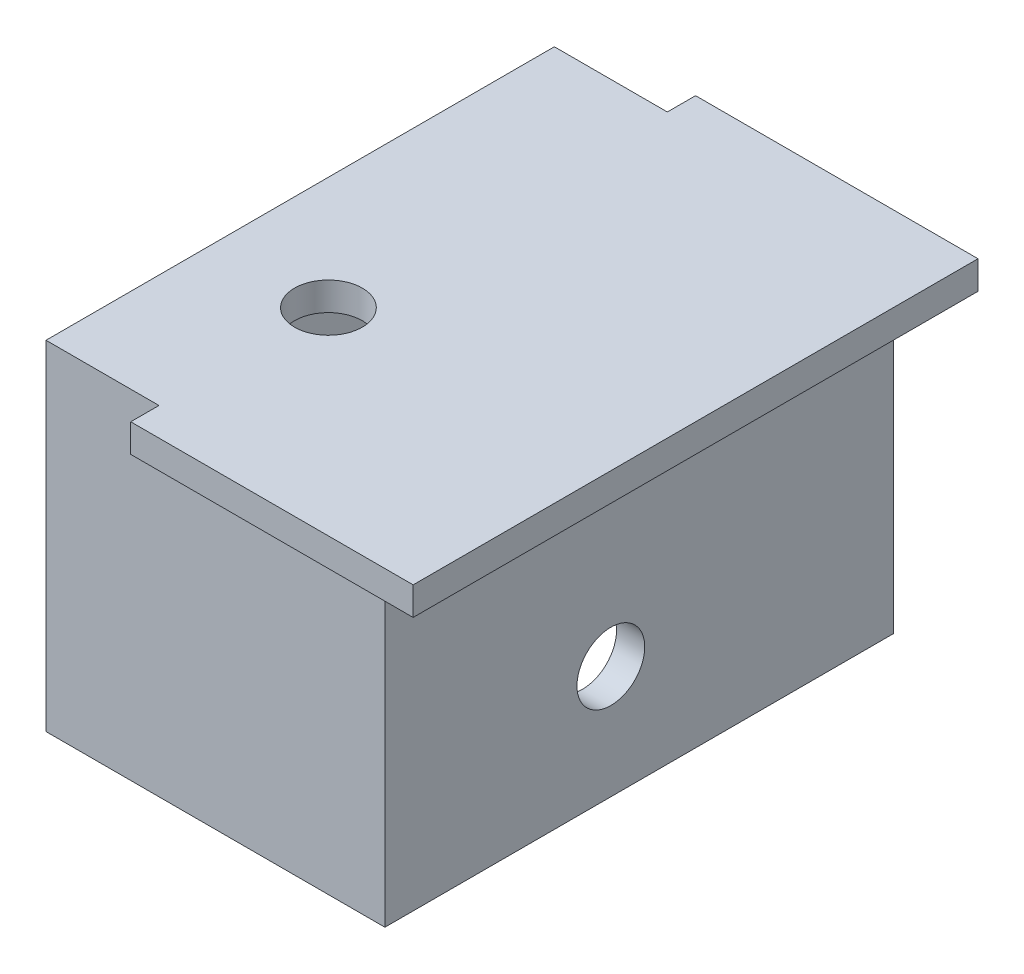
ISO-10303-21;
HEADER;
FILE_DESCRIPTION(('STEP AP214'),'2;1');
FILE_NAME('part.step','',(''),(''),'','','');
FILE_SCHEMA(('AUTOMOTIVE_DESIGN { 1 0 10303 214 1 1 1 1 }'));
ENDSEC;
DATA;
#1=APPLICATION_CONTEXT('core data for automotive mechanical design processes');
#2=APPLICATION_PROTOCOL_DEFINITION('international standard','automotive_design',2000,#1);
#3=PRODUCT_CONTEXT('',#1,'mechanical');
#4=PRODUCT('Part','Part','',(#3));
#5=PRODUCT_RELATED_PRODUCT_CATEGORY('part','',(#4));
#6=PRODUCT_DEFINITION_FORMATION('','',#4);
#7=PRODUCT_DEFINITION_CONTEXT('part definition',#1,'design');
#8=PRODUCT_DEFINITION('design','',#6,#7);
#9=PRODUCT_DEFINITION_SHAPE('','',#8);
#10=(LENGTH_UNIT() NAMED_UNIT(*) SI_UNIT(.MILLI.,.METRE.));
#11=(NAMED_UNIT(*) PLANE_ANGLE_UNIT() SI_UNIT($,.RADIAN.));
#12=(NAMED_UNIT(*) SI_UNIT($,.STERADIAN.) SOLID_ANGLE_UNIT());
#13=UNCERTAINTY_MEASURE_WITH_UNIT(LENGTH_MEASURE(1.E-05),#10,'distance_accuracy_value','');
#14=(GEOMETRIC_REPRESENTATION_CONTEXT(3) GLOBAL_UNCERTAINTY_ASSIGNED_CONTEXT((#13)) GLOBAL_UNIT_ASSIGNED_CONTEXT((#10,
#11,#12)) REPRESENTATION_CONTEXT('',''));
#15=CARTESIAN_POINT('',(0.,0.,0.));
#16=DIRECTION('',(0.,0.,1.));
#17=DIRECTION('',(1.,0.,0.));
#18=AXIS2_PLACEMENT_3D('',#15,#16,#17);
#19=CARTESIAN_POINT('',(0.,0.,100.));
#20=DIRECTION('',(0.,1.,0.));
#21=DIRECTION('',(-1.,0.,0.));
#22=AXIS2_PLACEMENT_3D('',#19,#20,#21);
#23=PLANE('',#22);
#24=CARTESIAN_POINT('',(-50.,0.,65.));
#25=DIRECTION('',(0.,1.,0.));
#26=DIRECTION('',(-1.,0.,0.));
#27=AXIS2_PLACEMENT_3D('',#24,#25,#26);
#28=CIRCLE('',#27,6.);
#29=CARTESIAN_POINT('',(-56.,0.,65.));
#30=VERTEX_POINT('',#29);
#31=EDGE_CURVE('E195',#30,#30,#28,.T.);
#32=ORIENTED_EDGE('',*,*,#31,.T.);
#33=EDGE_LOOP('',(#32));
#34=FACE_BOUND('',#33,.T.);
#35=DIRECTION('',(1.,0.,0.));
#36=VECTOR('',#35,1.);
#37=CARTESIAN_POINT('',(-65.,0.,90.));
#38=LINE('',#37,#36);
#39=CARTESIAN_POINT('',(-65.,0.,90.));
#40=VERTEX_POINT('',#39);
#41=CARTESIAN_POINT('',(-15.,0.,90.));
#42=VERTEX_POINT('',#41);
#43=EDGE_CURVE('E50',#40,#42,#38,.T.);
#44=ORIENTED_EDGE('',*,*,#43,.F.);
#45=DIRECTION('',(0.,0.,-1.));
#46=VECTOR('',#45,1.);
#47=CARTESIAN_POINT('',(-65.,0.,100.));
#48=LINE('',#47,#46);
#49=CARTESIAN_POINT('',(-65.,0.,10.));
#50=VERTEX_POINT('',#49);
#51=EDGE_CURVE('E249',#40,#50,#48,.T.);
#52=ORIENTED_EDGE('',*,*,#51,.T.);
#53=DIRECTION('',(-1.,0.,0.));
#54=VECTOR('',#53,1.);
#55=CARTESIAN_POINT('',(-15.,0.,10.));
#56=LINE('',#55,#54);
#57=CARTESIAN_POINT('',(-15.,0.,10.));
#58=VERTEX_POINT('',#57);
#59=EDGE_CURVE('E157',#58,#50,#56,.T.);
#60=ORIENTED_EDGE('',*,*,#59,.F.);
#61=DIRECTION('',(0.,0.,-1.));
#62=VECTOR('',#61,1.);
#63=CARTESIAN_POINT('',(-15.,0.,5.));
#64=LINE('',#63,#62);
#65=EDGE_CURVE('E160',#42,#58,#64,.T.);
#66=ORIENTED_EDGE('',*,*,#65,.F.);
#67=EDGE_LOOP('',(#44,#52,#60,#66));
#68=FACE_BOUND('',#67,.T.);
#69=ADVANCED_FACE('F33',(#34,#68),#23,.F.);
#70=DIRECTION('',(0.,0.,1.));
#71=VECTOR('',#70,1.);
#72=CARTESIAN_POINT('',(-50.,0.,95.));
#73=LINE('',#72,#71);
#74=CARTESIAN_POINT('',(-50.,0.,95.));
#75=VERTEX_POINT('',#74);
#76=CARTESIAN_POINT('',(-50.,0.,100.));
#77=VERTEX_POINT('',#76);
#78=EDGE_CURVE('E216',#75,#77,#73,.T.);
#79=ORIENTED_EDGE('',*,*,#78,.F.);
#80=DIRECTION('',(-1.,0.,0.));
#81=VECTOR('',#80,1.);
#82=CARTESIAN_POINT('',(-10.,0.,95.));
#83=LINE('',#82,#81);
#84=CARTESIAN_POINT('',(-10.,0.,95.));
#85=VERTEX_POINT('',#84);
#86=EDGE_CURVE('E182',#85,#75,#83,.T.);
#87=ORIENTED_EDGE('',*,*,#86,.F.);
#88=DIRECTION('',(0.,0.,1.));
#89=VECTOR('',#88,1.);
#90=CARTESIAN_POINT('',(-10.,0.,5.));
#91=LINE('',#90,#89);
#92=CARTESIAN_POINT('',(-10.,0.,5.));
#93=VERTEX_POINT('',#92);
#94=EDGE_CURVE('E176',#93,#85,#91,.T.);
#95=ORIENTED_EDGE('',*,*,#94,.F.);
#96=DIRECTION('',(1.,0.,0.));
#97=VECTOR('',#96,1.);
#98=CARTESIAN_POINT('',(-10.,0.,5.));
#99=LINE('',#98,#97);
#100=CARTESIAN_POINT('',(-50.,0.,5.));
#101=VERTEX_POINT('',#100);
#102=EDGE_CURVE('E178',#101,#93,#99,.T.);
#103=ORIENTED_EDGE('',*,*,#102,.F.);
#104=DIRECTION('',(0.,0.,-1.));
#105=VECTOR('',#104,1.);
#106=CARTESIAN_POINT('',(-50.,0.,5.));
#107=LINE('',#106,#105);
#108=CARTESIAN_POINT('',(-50.,0.,0.));
#109=VERTEX_POINT('',#108);
#110=EDGE_CURVE('E205',#101,#109,#107,.T.);
#111=ORIENTED_EDGE('',*,*,#110,.T.);
#112=DIRECTION('',(1.,0.,0.));
#113=VECTOR('',#112,1.);
#114=CARTESIAN_POINT('',(0.,0.,0.));
#115=LINE('',#114,#113);
#116=CARTESIAN_POINT('',(0.,0.,0.));
#117=VERTEX_POINT('',#116);
#118=EDGE_CURVE('E235',#109,#117,#115,.T.);
#119=ORIENTED_EDGE('',*,*,#118,.T.);
#120=DIRECTION('',(0.,0.,-1.));
#121=VECTOR('',#120,1.);
#122=CARTESIAN_POINT('',(0.,0.,100.));
#123=LINE('',#122,#121);
#124=CARTESIAN_POINT('',(0.,0.,100.));
#125=VERTEX_POINT('',#124);
#126=EDGE_CURVE('E240',#125,#117,#123,.T.);
#127=ORIENTED_EDGE('',*,*,#126,.F.);
#128=DIRECTION('',(1.,0.,0.));
#129=VECTOR('',#128,1.);
#130=CARTESIAN_POINT('',(0.,0.,100.));
#131=LINE('',#130,#129);
#132=EDGE_CURVE('E238',#77,#125,#131,.T.);
#133=ORIENTED_EDGE('',*,*,#132,.F.);
#134=EDGE_LOOP('',(#79,#87,#95,#103,#111,#119,#127,#133));
#135=FACE_BOUND('',#134,.T.);
#136=ADVANCED_FACE('F275',(#135),#23,.F.);
#137=CARTESIAN_POINT('',(-65.,0.,100.));
#138=DIRECTION('',(-1.,0.,0.));
#139=DIRECTION('',(0.,0.,1.));
#140=AXIS2_PLACEMENT_3D('',#137,#138,#139);
#141=PLANE('',#140);
#142=CARTESIAN_POINT('',(-65.,-35.,55.));
#143=DIRECTION('',(-1.,0.,0.));
#144=DIRECTION('',(0.,0.,1.));
#145=AXIS2_PLACEMENT_3D('',#142,#143,#144);
#146=CIRCLE('',#145,5.99999999999999);
#147=CARTESIAN_POINT('',(-65.,-35.,61.));
#148=VERTEX_POINT('',#147);
#149=EDGE_CURVE('E173',#148,#148,#146,.T.);
#150=ORIENTED_EDGE('',*,*,#149,.T.);
#151=EDGE_LOOP('',(#150));
#152=FACE_BOUND('',#151,.T.);
#153=DIRECTION('',(0.,1.,0.));
#154=VECTOR('',#153,1.);
#155=CARTESIAN_POINT('',(-65.,-55.,90.));
#156=LINE('',#155,#154);
#157=CARTESIAN_POINT('',(-65.,-55.,90.));
#158=VERTEX_POINT('',#157);
#159=EDGE_CURVE('E522',#158,#40,#156,.T.);
#160=ORIENTED_EDGE('',*,*,#159,.F.);
#161=DIRECTION('',(0.,0.,-1.));
#162=VECTOR('',#161,1.);
#163=CARTESIAN_POINT('',(-65.,-55.,100.));
#164=LINE('',#163,#162);
#165=CARTESIAN_POINT('',(-65.,-55.,10.));
#166=VERTEX_POINT('',#165);
#167=EDGE_CURVE('E251',#158,#166,#164,.T.);
#168=ORIENTED_EDGE('',*,*,#167,.T.);
#169=DIRECTION('',(0.,1.,0.));
#170=VECTOR('',#169,1.);
#171=CARTESIAN_POINT('',(-65.,-55.,10.));
#172=LINE('',#171,#170);
#173=EDGE_CURVE('E156',#166,#50,#172,.T.);
#174=ORIENTED_EDGE('',*,*,#173,.T.);
#175=ORIENTED_EDGE('',*,*,#51,.F.);
#176=EDGE_LOOP('',(#160,#168,#174,#175));
#177=FACE_BOUND('',#176,.T.);
#178=ADVANCED_FACE('F280',(#152,#177),#141,.F.);
#179=CARTESIAN_POINT('',(-15.,-55.,5.));
#180=DIRECTION('',(1.,0.,0.));
#181=DIRECTION('',(0.,1.,0.));
#182=AXIS2_PLACEMENT_3D('',#179,#180,#181);
#183=PLANE('',#182);
#184=CARTESIAN_POINT('',(-15.,-35.,55.));
#185=DIRECTION('',(1.,0.,0.));
#186=DIRECTION('',(0.,1.,0.));
#187=AXIS2_PLACEMENT_3D('',#184,#185,#186);
#188=CIRCLE('',#187,5.99999999999999);
#189=CARTESIAN_POINT('',(-15.,-29.,55.));
#190=VERTEX_POINT('',#189);
#191=EDGE_CURVE('E37',#190,#190,#188,.T.);
#192=ORIENTED_EDGE('',*,*,#191,.T.);
#193=EDGE_LOOP('',(#192));
#194=FACE_BOUND('',#193,.T.);
#195=DIRECTION('',(0.,1.,0.));
#196=VECTOR('',#195,1.);
#197=CARTESIAN_POINT('',(-15.,-55.,90.));
#198=LINE('',#197,#196);
#199=CARTESIAN_POINT('',(-15.,-55.,90.));
#200=VERTEX_POINT('',#199);
#201=EDGE_CURVE('E58',#200,#42,#198,.T.);
#202=ORIENTED_EDGE('',*,*,#201,.T.);
#203=ORIENTED_EDGE('',*,*,#65,.T.);
#204=DIRECTION('',(0.,1.,0.));
#205=VECTOR('',#204,1.);
#206=CARTESIAN_POINT('',(-15.,-55.,10.));
#207=LINE('',#206,#205);
#208=CARTESIAN_POINT('',(-15.,-55.,10.));
#209=VERTEX_POINT('',#208);
#210=EDGE_CURVE('E153',#209,#58,#207,.T.);
#211=ORIENTED_EDGE('',*,*,#210,.F.);
#212=DIRECTION('',(0.,0.,-1.));
#213=VECTOR('',#212,1.);
#214=CARTESIAN_POINT('',(-15.,-55.,5.));
#215=LINE('',#214,#213);
#216=EDGE_CURVE('E136',#200,#209,#215,.T.);
#217=ORIENTED_EDGE('',*,*,#216,.F.);
#218=EDGE_LOOP('',(#202,#203,#211,#217));
#219=FACE_BOUND('',#218,.T.);
#220=ADVANCED_FACE('F159',(#194,#219),#183,.F.);
#221=CARTESIAN_POINT('',(0.,5.,100.));
#222=DIRECTION('',(0.,-1.,0.));
#223=DIRECTION('',(1.,0.,0.));
#224=AXIS2_PLACEMENT_3D('',#221,#222,#223);
#225=PLANE('',#224);
#226=CARTESIAN_POINT('',(-50.,5.,65.));
#227=DIRECTION('',(0.,1.,0.));
#228=DIRECTION('',(-1.,0.,0.));
#229=AXIS2_PLACEMENT_3D('',#226,#227,#228);
#230=CIRCLE('',#229,6.);
#231=CARTESIAN_POINT('',(-56.,5.,65.));
#232=VERTEX_POINT('',#231);
#233=EDGE_CURVE('E192',#232,#232,#230,.T.);
#234=ORIENTED_EDGE('',*,*,#233,.F.);
#235=EDGE_LOOP('',(#234));
#236=FACE_BOUND('',#235,.T.);
#237=DIRECTION('',(1.,0.,0.));
#238=VECTOR('',#237,1.);
#239=CARTESIAN_POINT('',(-65.,5.,5.));
#240=LINE('',#239,#238);
#241=CARTESIAN_POINT('',(-70.,4.99999999999999,5.));
#242=VERTEX_POINT('',#241);
#243=CARTESIAN_POINT('',(-50.,5.,5.));
#244=VERTEX_POINT('',#243);
#245=EDGE_CURVE('E196',#242,#244,#240,.T.);
#246=ORIENTED_EDGE('',*,*,#245,.F.);
#247=DIRECTION('',(0.,0.,1.));
#248=VECTOR('',#247,1.);
#249=CARTESIAN_POINT('',(-70.,4.99999999999999,0.));
#250=LINE('',#249,#248);
#251=CARTESIAN_POINT('',(-70.,4.99999999999999,95.));
#252=VERTEX_POINT('',#251);
#253=EDGE_CURVE('E161',#242,#252,#250,.T.);
#254=ORIENTED_EDGE('',*,*,#253,.T.);
#255=DIRECTION('',(-1.,0.,0.));
#256=VECTOR('',#255,1.);
#257=CARTESIAN_POINT('',(-65.,5.,95.));
#258=LINE('',#257,#256);
#259=CARTESIAN_POINT('',(-50.,5.,95.));
#260=VERTEX_POINT('',#259);
#261=EDGE_CURVE('E213',#260,#252,#258,.T.);
#262=ORIENTED_EDGE('',*,*,#261,.F.);
#263=DIRECTION('',(0.,0.,1.));
#264=VECTOR('',#263,1.);
#265=CARTESIAN_POINT('',(-50.,5.,95.));
#266=LINE('',#265,#264);
#267=CARTESIAN_POINT('',(-50.,5.,100.));
#268=VERTEX_POINT('',#267);
#269=EDGE_CURVE('E218',#260,#268,#266,.T.);
#270=ORIENTED_EDGE('',*,*,#269,.T.);
#271=DIRECTION('',(-1.,0.,0.));
#272=VECTOR('',#271,1.);
#273=CARTESIAN_POINT('',(0.,5.,100.));
#274=LINE('',#273,#272);
#275=CARTESIAN_POINT('',(0.,5.,100.));
#276=VERTEX_POINT('',#275);
#277=EDGE_CURVE('E234',#276,#268,#274,.T.);
#278=ORIENTED_EDGE('',*,*,#277,.F.);
#279=DIRECTION('',(0.,0.,-1.));
#280=VECTOR('',#279,1.);
#281=CARTESIAN_POINT('',(0.,5.,100.));
#282=LINE('',#281,#280);
#283=CARTESIAN_POINT('',(0.,5.,0.));
#284=VERTEX_POINT('',#283);
#285=EDGE_CURVE('E11',#276,#284,#282,.T.);
#286=ORIENTED_EDGE('',*,*,#285,.T.);
#287=DIRECTION('',(-1.,0.,0.));
#288=VECTOR('',#287,1.);
#289=CARTESIAN_POINT('',(0.,5.,0.));
#290=LINE('',#289,#288);
#291=CARTESIAN_POINT('',(-50.,5.,0.));
#292=VERTEX_POINT('',#291);
#293=EDGE_CURVE('E243',#284,#292,#290,.T.);
#294=ORIENTED_EDGE('',*,*,#293,.T.);
#295=DIRECTION('',(0.,0.,-1.));
#296=VECTOR('',#295,1.);
#297=CARTESIAN_POINT('',(-50.,5.,5.));
#298=LINE('',#297,#296);
#299=EDGE_CURVE('E203',#244,#292,#298,.T.);
#300=ORIENTED_EDGE('',*,*,#299,.F.);
#301=EDGE_LOOP('',(#246,#254,#262,#270,#278,#286,#294,#300));
#302=FACE_BOUND('',#301,.T.);
#303=ADVANCED_FACE('F293',(#236,#302),#225,.F.);
#304=CARTESIAN_POINT('',(-70.,0.,100.));
#305=DIRECTION('',(1.,0.,0.));
#306=DIRECTION('',(0.,1.,0.));
#307=AXIS2_PLACEMENT_3D('',#304,#305,#306);
#308=PLANE('',#307);
#309=CARTESIAN_POINT('',(-70.,-35.,55.));
#310=DIRECTION('',(-1.,0.,0.));
#311=DIRECTION('',(0.,-1.,0.));
#312=AXIS2_PLACEMENT_3D('',#309,#310,#311);
#313=CIRCLE('',#312,5.99999999999999);
#314=CARTESIAN_POINT('',(-70.,-41.,55.));
#315=VERTEX_POINT('',#314);
#316=EDGE_CURVE('E163',#315,#315,#313,.T.);
#317=ORIENTED_EDGE('',*,*,#316,.F.);
#318=EDGE_LOOP('',(#317));
#319=FACE_BOUND('',#318,.T.);
#320=ORIENTED_EDGE('',*,*,#253,.F.);
#321=DIRECTION('',(0.,1.,0.));
#322=VECTOR('',#321,1.);
#323=CARTESIAN_POINT('',(-70.,0.,5.));
#324=LINE('',#323,#322);
#325=CARTESIAN_POINT('',(-70.,-55.,5.));
#326=VERTEX_POINT('',#325);
#327=EDGE_CURVE('E224',#326,#242,#324,.T.);
#328=ORIENTED_EDGE('',*,*,#327,.F.);
#329=DIRECTION('',(0.,0.,-1.));
#330=VECTOR('',#329,1.);
#331=CARTESIAN_POINT('',(-70.,-55.,100.));
#332=LINE('',#331,#330);
#333=CARTESIAN_POINT('',(-70.,-55.,95.));
#334=VERTEX_POINT('',#333);
#335=EDGE_CURVE('E42',#334,#326,#332,.T.);
#336=ORIENTED_EDGE('',*,*,#335,.F.);
#337=DIRECTION('',(0.,-1.,0.));
#338=VECTOR('',#337,1.);
#339=CARTESIAN_POINT('',(-70.,0.,95.));
#340=LINE('',#339,#338);
#341=EDGE_CURVE('E226',#252,#334,#340,.T.);
#342=ORIENTED_EDGE('',*,*,#341,.F.);
#343=EDGE_LOOP('',(#320,#328,#336,#342));
#344=FACE_BOUND('',#343,.T.);
#345=ADVANCED_FACE('F291',(#319,#344),#308,.F.);
#346=CARTESIAN_POINT('',(-65.,-55.,100.));
#347=DIRECTION('',(0.,1.,0.));
#348=DIRECTION('',(0.,0.,1.));
#349=AXIS2_PLACEMENT_3D('',#346,#347,#348);
#350=PLANE('',#349);
#351=ORIENTED_EDGE('',*,*,#167,.F.);
#352=DIRECTION('',(1.,0.,0.));
#353=VECTOR('',#352,1.);
#354=CARTESIAN_POINT('',(-65.,-55.,90.));
#355=LINE('',#354,#353);
#356=EDGE_CURVE('E144',#158,#200,#355,.T.);
#357=ORIENTED_EDGE('',*,*,#356,.T.);
#358=ORIENTED_EDGE('',*,*,#216,.T.);
#359=DIRECTION('',(-1.,0.,0.));
#360=VECTOR('',#359,1.);
#361=CARTESIAN_POINT('',(-15.,-55.,10.));
#362=LINE('',#361,#360);
#363=EDGE_CURVE('E141',#209,#166,#362,.T.);
#364=ORIENTED_EDGE('',*,*,#363,.T.);
#365=EDGE_LOOP('',(#351,#357,#358,#364));
#366=FACE_BOUND('',#365,.T.);
#367=DIRECTION('',(-1.,0.,0.));
#368=VECTOR('',#367,1.);
#369=CARTESIAN_POINT('',(-65.,-55.,5.));
#370=LINE('',#369,#368);
#371=CARTESIAN_POINT('',(-10.,-55.,5.));
#372=VERTEX_POINT('',#371);
#373=EDGE_CURVE('E221',#372,#326,#370,.T.);
#374=ORIENTED_EDGE('',*,*,#373,.F.);
#375=DIRECTION('',(0.,0.,1.));
#376=VECTOR('',#375,1.);
#377=CARTESIAN_POINT('',(-10.,-55.,5.));
#378=LINE('',#377,#376);
#379=CARTESIAN_POINT('',(-10.,-55.,95.));
#380=VERTEX_POINT('',#379);
#381=EDGE_CURVE('E147',#372,#380,#378,.T.);
#382=ORIENTED_EDGE('',*,*,#381,.T.);
#383=DIRECTION('',(1.,0.,0.));
#384=VECTOR('',#383,1.);
#385=CARTESIAN_POINT('',(-65.,-55.,95.));
#386=LINE('',#385,#384);
#387=EDGE_CURVE('E228',#334,#380,#386,.T.);
#388=ORIENTED_EDGE('',*,*,#387,.F.);
#389=ORIENTED_EDGE('',*,*,#335,.T.);
#390=EDGE_LOOP('',(#374,#382,#388,#389));
#391=FACE_BOUND('',#390,.T.);
#392=ADVANCED_FACE('F139',(#366,#391),#350,.F.);
#393=CARTESIAN_POINT('',(0.,0.,100.));
#394=DIRECTION('',(-1.,0.,0.));
#395=DIRECTION('',(0.,0.,1.));
#396=AXIS2_PLACEMENT_3D('',#393,#394,#395);
#397=PLANE('',#396);
#398=DIRECTION('',(0.,1.,0.));
#399=VECTOR('',#398,1.);
#400=CARTESIAN_POINT('',(0.,0.,0.));
#401=LINE('',#400,#399);
#402=EDGE_CURVE('E230',#117,#284,#401,.T.);
#403=ORIENTED_EDGE('',*,*,#402,.T.);
#404=ORIENTED_EDGE('',*,*,#285,.F.);
#405=DIRECTION('',(0.,1.,0.));
#406=VECTOR('',#405,1.);
#407=CARTESIAN_POINT('',(0.,0.,100.));
#408=LINE('',#407,#406);
#409=EDGE_CURVE('E231',#125,#276,#408,.T.);
#410=ORIENTED_EDGE('',*,*,#409,.F.);
#411=ORIENTED_EDGE('',*,*,#126,.T.);
#412=EDGE_LOOP('',(#403,#404,#410,#411));
#413=FACE_BOUND('',#412,.T.);
#414=ADVANCED_FACE('F35',(#413),#397,.F.);
#415=CARTESIAN_POINT('',(0.,0.,100.));
#416=DIRECTION('',(0.,0.,1.));
#417=DIRECTION('',(1.,0.,0.));
#418=AXIS2_PLACEMENT_3D('',#415,#416,#417);
#419=PLANE('',#418);
#420=DIRECTION('',(0.,1.,0.));
#421=VECTOR('',#420,1.);
#422=CARTESIAN_POINT('',(-50.,5.,100.));
#423=LINE('',#422,#421);
#424=EDGE_CURVE('E208',#77,#268,#423,.T.);
#425=ORIENTED_EDGE('',*,*,#424,.F.);
#426=ORIENTED_EDGE('',*,*,#132,.T.);
#427=ORIENTED_EDGE('',*,*,#409,.T.);
#428=ORIENTED_EDGE('',*,*,#277,.T.);
#429=EDGE_LOOP('',(#425,#426,#427,#428));
#430=FACE_BOUND('',#429,.T.);
#431=ADVANCED_FACE('F320',(#430),#419,.T.);
#432=CARTESIAN_POINT('',(0.,0.,0.));
#433=DIRECTION('',(0.,0.,1.));
#434=DIRECTION('',(1.,0.,0.));
#435=AXIS2_PLACEMENT_3D('',#432,#433,#434);
#436=PLANE('',#435);
#437=ORIENTED_EDGE('',*,*,#118,.F.);
#438=DIRECTION('',(0.,-1.,0.));
#439=VECTOR('',#438,1.);
#440=CARTESIAN_POINT('',(-50.,5.,0.));
#441=LINE('',#440,#439);
#442=EDGE_CURVE('E200',#292,#109,#441,.T.);
#443=ORIENTED_EDGE('',*,*,#442,.F.);
#444=ORIENTED_EDGE('',*,*,#293,.F.);
#445=ORIENTED_EDGE('',*,*,#402,.F.);
#446=EDGE_LOOP('',(#437,#443,#444,#445));
#447=FACE_BOUND('',#446,.T.);
#448=ADVANCED_FACE('F284',(#447),#436,.F.);
#449=CARTESIAN_POINT('',(0.,0.,95.));
#450=DIRECTION('',(0.,0.,-1.));
#451=DIRECTION('',(-1.,0.,0.));
#452=AXIS2_PLACEMENT_3D('',#449,#450,#451);
#453=PLANE('',#452);
#454=ORIENTED_EDGE('',*,*,#387,.T.);
#455=DIRECTION('',(0.,1.,0.));
#456=VECTOR('',#455,1.);
#457=CARTESIAN_POINT('',(-10.,-55.,95.));
#458=LINE('',#457,#456);
#459=EDGE_CURVE('E189',#380,#85,#458,.T.);
#460=ORIENTED_EDGE('',*,*,#459,.T.);
#461=ORIENTED_EDGE('',*,*,#86,.T.);
#462=DIRECTION('',(0.,1.,0.));
#463=VECTOR('',#462,1.);
#464=CARTESIAN_POINT('',(-50.,5.,95.));
#465=LINE('',#464,#463);
#466=EDGE_CURVE('E210',#75,#260,#465,.T.);
#467=ORIENTED_EDGE('',*,*,#466,.T.);
#468=ORIENTED_EDGE('',*,*,#261,.T.);
#469=ORIENTED_EDGE('',*,*,#341,.T.);
#470=EDGE_LOOP('',(#454,#460,#461,#467,#468,#469));
#471=FACE_BOUND('',#470,.T.);
#472=ADVANCED_FACE('F315',(#471),#453,.F.);
#473=CARTESIAN_POINT('',(0.,0.,5.));
#474=DIRECTION('',(0.,0.,-1.));
#475=DIRECTION('',(-1.,0.,0.));
#476=AXIS2_PLACEMENT_3D('',#473,#474,#475);
#477=PLANE('',#476);
#478=DIRECTION('',(0.,1.,0.));
#479=VECTOR('',#478,1.);
#480=CARTESIAN_POINT('',(-10.,-55.,5.));
#481=LINE('',#480,#479);
#482=EDGE_CURVE('E146',#372,#93,#481,.T.);
#483=ORIENTED_EDGE('',*,*,#482,.F.);
#484=ORIENTED_EDGE('',*,*,#373,.T.);
#485=ORIENTED_EDGE('',*,*,#327,.T.);
#486=ORIENTED_EDGE('',*,*,#245,.T.);
#487=DIRECTION('',(0.,-1.,0.));
#488=VECTOR('',#487,1.);
#489=CARTESIAN_POINT('',(-50.,5.,5.));
#490=LINE('',#489,#488);
#491=EDGE_CURVE('E199',#244,#101,#490,.T.);
#492=ORIENTED_EDGE('',*,*,#491,.T.);
#493=ORIENTED_EDGE('',*,*,#102,.T.);
#494=EDGE_LOOP('',(#483,#484,#485,#486,#492,#493));
#495=FACE_BOUND('',#494,.T.);
#496=ADVANCED_FACE('F333',(#495),#477,.T.);
#497=CARTESIAN_POINT('',(-50.,5.,95.));
#498=DIRECTION('',(1.,0.,0.));
#499=DIRECTION('',(0.,0.,-1.));
#500=AXIS2_PLACEMENT_3D('',#497,#498,#499);
#501=PLANE('',#500);
#502=ORIENTED_EDGE('',*,*,#424,.T.);
#503=ORIENTED_EDGE('',*,*,#269,.F.);
#504=ORIENTED_EDGE('',*,*,#466,.F.);
#505=ORIENTED_EDGE('',*,*,#78,.T.);
#506=EDGE_LOOP('',(#502,#503,#504,#505));
#507=FACE_BOUND('',#506,.T.);
#508=ADVANCED_FACE('F271',(#507),#501,.F.);
#509=CARTESIAN_POINT('',(-50.,5.,5.));
#510=DIRECTION('',(1.,0.,0.));
#511=DIRECTION('',(0.,0.,-1.));
#512=AXIS2_PLACEMENT_3D('',#509,#510,#511);
#513=PLANE('',#512);
#514=ORIENTED_EDGE('',*,*,#442,.T.);
#515=ORIENTED_EDGE('',*,*,#110,.F.);
#516=ORIENTED_EDGE('',*,*,#491,.F.);
#517=ORIENTED_EDGE('',*,*,#299,.T.);
#518=EDGE_LOOP('',(#514,#515,#516,#517));
#519=FACE_BOUND('',#518,.T.);
#520=ADVANCED_FACE('F261',(#519),#513,.F.);
#521=CARTESIAN_POINT('',(-50.,-5.,65.));
#522=DIRECTION('',(0.,1.,0.));
#523=DIRECTION('',(-1.,0.,0.));
#524=AXIS2_PLACEMENT_3D('',#521,#522,#523);
#525=CYLINDRICAL_SURFACE('',#524,6.);
#526=ORIENTED_EDGE('',*,*,#233,.T.);
#527=EDGE_LOOP('',(#526));
#528=FACE_BOUND('',#527,.T.);
#529=ORIENTED_EDGE('',*,*,#31,.F.);
#530=EDGE_LOOP('',(#529));
#531=FACE_BOUND('',#530,.T.);
#532=ADVANCED_FACE('F258',(#528,#531),#525,.F.);
#533=CARTESIAN_POINT('',(-10.,-55.,5.));
#534=DIRECTION('',(-1.,0.,0.));
#535=DIRECTION('',(0.,-1.,0.));
#536=AXIS2_PLACEMENT_3D('',#533,#534,#535);
#537=PLANE('',#536);
#538=CARTESIAN_POINT('',(-10.,-35.,55.));
#539=DIRECTION('',(-1.,0.,0.));
#540=DIRECTION('',(0.,-1.,0.));
#541=AXIS2_PLACEMENT_3D('',#538,#539,#540);
#542=CIRCLE('',#541,5.99999999999999);
#543=CARTESIAN_POINT('',(-10.,-41.,55.));
#544=VERTEX_POINT('',#543);
#545=EDGE_CURVE('E170',#544,#544,#542,.T.);
#546=ORIENTED_EDGE('',*,*,#545,.T.);
#547=EDGE_LOOP('',(#546));
#548=FACE_BOUND('',#547,.T.);
#549=ORIENTED_EDGE('',*,*,#94,.T.);
#550=ORIENTED_EDGE('',*,*,#459,.F.);
#551=ORIENTED_EDGE('',*,*,#381,.F.);
#552=ORIENTED_EDGE('',*,*,#482,.T.);
#553=EDGE_LOOP('',(#549,#550,#551,#552));
#554=FACE_BOUND('',#553,.T.);
#555=ADVANCED_FACE('F260',(#548,#554),#537,.F.);
#556=CARTESIAN_POINT('',(9.99999999999999,-35.,55.));
#557=DIRECTION('',(-1.,0.,0.));
#558=DIRECTION('',(0.,-1.,0.));
#559=AXIS2_PLACEMENT_3D('',#556,#557,#558);
#560=CYLINDRICAL_SURFACE('',#559,5.99999999999999);
#561=ORIENTED_EDGE('',*,*,#191,.F.);
#562=EDGE_LOOP('',(#561));
#563=FACE_BOUND('',#562,.T.);
#564=ORIENTED_EDGE('',*,*,#545,.F.);
#565=EDGE_LOOP('',(#564));
#566=FACE_BOUND('',#565,.T.);
#567=ADVANCED_FACE('F268',(#563,#566),#560,.F.);
#568=ORIENTED_EDGE('',*,*,#316,.T.);
#569=EDGE_LOOP('',(#568));
#570=FACE_BOUND('',#569,.T.);
#571=ORIENTED_EDGE('',*,*,#149,.F.);
#572=EDGE_LOOP('',(#571));
#573=FACE_BOUND('',#572,.T.);
#574=ADVANCED_FACE('F430',(#570,#573),#560,.F.);
#575=CARTESIAN_POINT('',(-15.,-55.,10.));
#576=DIRECTION('',(0.,0.,-1.));
#577=DIRECTION('',(-1.,0.,0.));
#578=AXIS2_PLACEMENT_3D('',#575,#576,#577);
#579=PLANE('',#578);
#580=ORIENTED_EDGE('',*,*,#59,.T.);
#581=ORIENTED_EDGE('',*,*,#173,.F.);
#582=ORIENTED_EDGE('',*,*,#363,.F.);
#583=ORIENTED_EDGE('',*,*,#210,.T.);
#584=EDGE_LOOP('',(#580,#581,#582,#583));
#585=FACE_BOUND('',#584,.T.);
#586=ADVANCED_FACE('F152',(#585),#579,.F.);
#587=CARTESIAN_POINT('',(-65.,-55.,90.));
#588=DIRECTION('',(0.,0.,1.));
#589=DIRECTION('',(1.,0.,0.));
#590=AXIS2_PLACEMENT_3D('',#587,#588,#589);
#591=PLANE('',#590);
#592=ORIENTED_EDGE('',*,*,#43,.T.);
#593=ORIENTED_EDGE('',*,*,#201,.F.);
#594=ORIENTED_EDGE('',*,*,#356,.F.);
#595=ORIENTED_EDGE('',*,*,#159,.T.);
#596=EDGE_LOOP('',(#592,#593,#594,#595));
#597=FACE_BOUND('',#596,.T.);
#598=ADVANCED_FACE('F429',(#597),#591,.F.);
#599=CLOSED_SHELL('',(#69,#136,#178,#220,#303,#345,#392,#414,#431,#448,#472,#496,#508,#520,#532,
#555,#567,#574,#586,#598));
#600=MANIFOLD_SOLID_BREP('B2',#599);
#601=ADVANCED_BREP_SHAPE_REPRESENTATION('',(#18,#600),#14);
#602=SHAPE_DEFINITION_REPRESENTATION(#9,#601);
ENDSEC;
END-ISO-10303-21;
